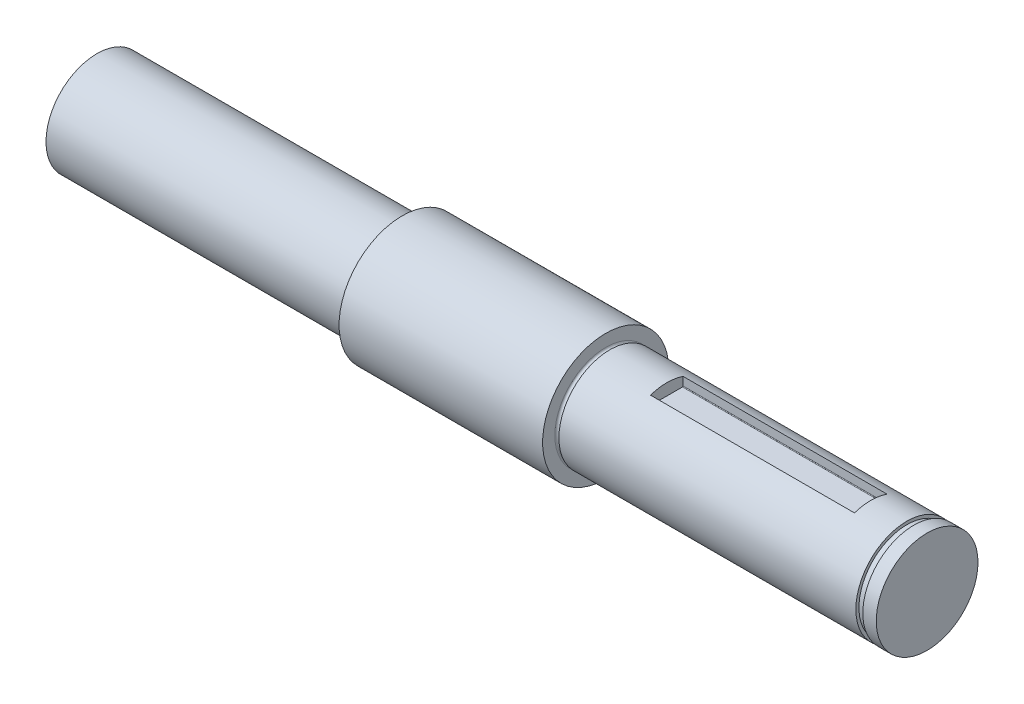
ISO-10303-21;
HEADER;
FILE_DESCRIPTION(('STEP AP214'),'2;1');
FILE_NAME('part.step','',(''),(''),'','','');
FILE_SCHEMA(('AUTOMOTIVE_DESIGN { 1 0 10303 214 1 1 1 1 }'));
ENDSEC;
DATA;
#1=APPLICATION_CONTEXT('core data for automotive mechanical design processes');
#2=APPLICATION_PROTOCOL_DEFINITION('international standard','automotive_design',2000,#1);
#3=PRODUCT_CONTEXT('',#1,'mechanical');
#4=PRODUCT('Part','Part','',(#3));
#5=PRODUCT_RELATED_PRODUCT_CATEGORY('part','',(#4));
#6=PRODUCT_DEFINITION_FORMATION('','',#4);
#7=PRODUCT_DEFINITION_CONTEXT('part definition',#1,'design');
#8=PRODUCT_DEFINITION('design','',#6,#7);
#9=PRODUCT_DEFINITION_SHAPE('','',#8);
#10=(LENGTH_UNIT() NAMED_UNIT(*) SI_UNIT(.MILLI.,.METRE.));
#11=(NAMED_UNIT(*) PLANE_ANGLE_UNIT() SI_UNIT($,.RADIAN.));
#12=(NAMED_UNIT(*) SI_UNIT($,.STERADIAN.) SOLID_ANGLE_UNIT());
#13=UNCERTAINTY_MEASURE_WITH_UNIT(LENGTH_MEASURE(1.E-05),#10,'distance_accuracy_value','');
#14=(GEOMETRIC_REPRESENTATION_CONTEXT(3) GLOBAL_UNCERTAINTY_ASSIGNED_CONTEXT((#13)) GLOBAL_UNIT_ASSIGNED_CONTEXT((#10,
#11,#12)) REPRESENTATION_CONTEXT('',''));
#15=CARTESIAN_POINT('',(0.,0.,0.));
#16=DIRECTION('',(0.,0.,1.));
#17=DIRECTION('',(1.,0.,0.));
#18=AXIS2_PLACEMENT_3D('',#15,#16,#17);
#19=CARTESIAN_POINT('',(200.,0.,0.));
#20=DIRECTION('',(-1.,0.,0.));
#21=DIRECTION('',(0.,0.,1.));
#22=AXIS2_PLACEMENT_3D('',#19,#20,#21);
#23=CYLINDRICAL_SURFACE('',#22,25.);
#24=CARTESIAN_POINT('',(52.,0.,0.));
#25=DIRECTION('',(-1.,0.,0.));
#26=DIRECTION('',(0.,0.,1.));
#27=AXIS2_PLACEMENT_3D('',#24,#25,#26);
#28=CIRCLE('',#27,25.);
#29=CARTESIAN_POINT('',(52.,0.,25.));
#30=VERTEX_POINT('',#29);
#31=EDGE_CURVE('E146',#30,#30,#28,.T.);
#32=ORIENTED_EDGE('',*,*,#31,.F.);
#33=EDGE_LOOP('',(#32));
#34=FACE_BOUND('',#33,.T.);
#35=DIRECTION('',(-1.,0.,0.));
#36=VECTOR('',#35,1.);
#37=CARTESIAN_POINT('',(180.215,23.685438564654,-8.));
#38=LINE('',#37,#36);
#39=CARTESIAN_POINT('',(180.215,23.685438564654,-8.));
#40=VERTEX_POINT('',#39);
#41=CARTESIAN_POINT('',(80.,23.685438564654,-8.));
#42=VERTEX_POINT('',#41);
#43=EDGE_CURVE('E54',#40,#42,#38,.T.);
#44=ORIENTED_EDGE('',*,*,#43,.F.);
#45=CARTESIAN_POINT('',(180.215,0.,0.));
#46=DIRECTION('',(1.,0.,0.));
#47=DIRECTION('',(0.,0.,-1.));
#48=AXIS2_PLACEMENT_3D('',#45,#46,#47);
#49=CIRCLE('',#48,25.);
#50=CARTESIAN_POINT('',(180.215,23.685438564654,8.));
#51=VERTEX_POINT('',#50);
#52=EDGE_CURVE('E135',#40,#51,#49,.T.);
#53=ORIENTED_EDGE('',*,*,#52,.T.);
#54=DIRECTION('',(-1.,0.,0.));
#55=VECTOR('',#54,1.);
#56=CARTESIAN_POINT('',(180.215,23.685438564654,8.));
#57=LINE('',#56,#55);
#58=CARTESIAN_POINT('',(80.,23.685438564654,8.));
#59=VERTEX_POINT('',#58);
#60=EDGE_CURVE('E142',#51,#59,#57,.T.);
#61=ORIENTED_EDGE('',*,*,#60,.T.);
#62=CARTESIAN_POINT('',(80.,0.,0.));
#63=DIRECTION('',(1.,0.,0.));
#64=DIRECTION('',(0.,0.,-1.));
#65=AXIS2_PLACEMENT_3D('',#62,#63,#64);
#66=CIRCLE('',#65,25.);
#67=EDGE_CURVE('E122',#42,#59,#66,.T.);
#68=ORIENTED_EDGE('',*,*,#67,.F.);
#69=EDGE_LOOP('',(#44,#53,#61,#68));
#70=FACE_BOUND('',#69,.T.);
#71=CARTESIAN_POINT('',(197.91,0.,0.));
#72=DIRECTION('',(1.,0.,0.));
#73=DIRECTION('',(0.,0.,-1.));
#74=AXIS2_PLACEMENT_3D('',#71,#72,#73);
#75=CIRCLE('',#74,25.);
#76=CARTESIAN_POINT('',(197.91,0.,-25.));
#77=VERTEX_POINT('',#76);
#78=EDGE_CURVE('E209',#77,#77,#75,.T.);
#79=ORIENTED_EDGE('',*,*,#78,.F.);
#80=EDGE_LOOP('',(#79));
#81=FACE_BOUND('',#80,.T.);
#82=ADVANCED_FACE('F39',(#34,#70,#81),#23,.T.);
#83=CARTESIAN_POINT('',(-200.,0.,0.));
#84=DIRECTION('',(1.,0.,0.));
#85=DIRECTION('',(0.,0.,-1.));
#86=AXIS2_PLACEMENT_3D('',#83,#84,#85);
#87=CIRCLE('',#86,25.);
#88=CARTESIAN_POINT('',(-200.,0.,-25.));
#89=VERTEX_POINT('',#88);
#90=EDGE_CURVE('E153',#89,#89,#87,.T.);
#91=ORIENTED_EDGE('',*,*,#90,.T.);
#92=EDGE_LOOP('',(#91));
#93=FACE_BOUND('',#92,.T.);
#94=CARTESIAN_POINT('',(-52.,0.,0.));
#95=DIRECTION('',(-1.,0.,0.));
#96=DIRECTION('',(0.,0.,1.));
#97=AXIS2_PLACEMENT_3D('',#94,#95,#96);
#98=CIRCLE('',#97,25.);
#99=CARTESIAN_POINT('',(-52.,0.,25.));
#100=VERTEX_POINT('',#99);
#101=EDGE_CURVE('E145',#100,#100,#98,.T.);
#102=ORIENTED_EDGE('',*,*,#101,.T.);
#103=EDGE_LOOP('',(#102));
#104=FACE_BOUND('',#103,.T.);
#105=ADVANCED_FACE('F181',(#93,#104),#23,.T.);
#106=CARTESIAN_POINT('',(-200.,0.,0.));
#107=DIRECTION('',(1.,0.,0.));
#108=DIRECTION('',(0.,0.,-1.));
#109=AXIS2_PLACEMENT_3D('',#106,#107,#108);
#110=PLANE('',#109);
#111=ORIENTED_EDGE('',*,*,#90,.F.);
#112=EDGE_LOOP('',(#111));
#113=FACE_BOUND('',#112,.T.);
#114=ADVANCED_FACE('F175',(#113),#110,.F.);
#115=CARTESIAN_POINT('',(-51.,0.,0.));
#116=DIRECTION('',(-1.,0.,0.));
#117=DIRECTION('',(0.,0.,1.));
#118=AXIS2_PLACEMENT_3D('',#115,#116,#117);
#119=TOROIDAL_SURFACE('',#118,25.,1.);
#120=CARTESIAN_POINT('',(-50.,0.,0.));
#121=DIRECTION('',(-1.,0.,0.));
#122=DIRECTION('',(0.,0.,1.));
#123=AXIS2_PLACEMENT_3D('',#120,#121,#122);
#124=CIRCLE('',#123,25.);
#125=CARTESIAN_POINT('',(-50.,0.,25.));
#126=VERTEX_POINT('',#125);
#127=EDGE_CURVE('E150',#126,#126,#124,.T.);
#128=ORIENTED_EDGE('',*,*,#127,.T.);
#129=EDGE_LOOP('',(#128));
#130=FACE_BOUND('',#129,.T.);
#131=ORIENTED_EDGE('',*,*,#101,.F.);
#132=EDGE_LOOP('',(#131));
#133=FACE_BOUND('',#132,.T.);
#134=ADVANCED_FACE('F167',(#130,#133),#119,.F.);
#135=CARTESIAN_POINT('',(-50.,0.,0.));
#136=DIRECTION('',(1.,0.,0.));
#137=DIRECTION('',(0.,0.,-1.));
#138=AXIS2_PLACEMENT_3D('',#135,#136,#137);
#139=PLANE('',#138);
#140=ORIENTED_EDGE('',*,*,#127,.F.);
#141=EDGE_LOOP('',(#140));
#142=FACE_BOUND('',#141,.T.);
#143=CARTESIAN_POINT('',(-50.,0.,0.));
#144=DIRECTION('',(1.,0.,0.));
#145=DIRECTION('',(0.,0.,-1.));
#146=AXIS2_PLACEMENT_3D('',#143,#144,#145);
#147=CIRCLE('',#146,31.);
#148=CARTESIAN_POINT('',(-50.,0.,-31.));
#149=VERTEX_POINT('',#148);
#150=EDGE_CURVE('E43',#149,#149,#147,.T.);
#151=ORIENTED_EDGE('',*,*,#150,.F.);
#152=EDGE_LOOP('',(#151));
#153=FACE_BOUND('',#152,.T.);
#154=ADVANCED_FACE('F165',(#142,#153),#139,.F.);
#155=CARTESIAN_POINT('',(50.,0.,0.));
#156=DIRECTION('',(-1.,0.,0.));
#157=DIRECTION('',(0.,0.,1.));
#158=AXIS2_PLACEMENT_3D('',#155,#156,#157);
#159=CYLINDRICAL_SURFACE('',#158,31.);
#160=CARTESIAN_POINT('',(50.,0.,0.));
#161=DIRECTION('',(1.,0.,0.));
#162=DIRECTION('',(0.,0.,-1.));
#163=AXIS2_PLACEMENT_3D('',#160,#161,#162);
#164=CIRCLE('',#163,31.);
#165=CARTESIAN_POINT('',(50.,0.,-31.));
#166=VERTEX_POINT('',#165);
#167=EDGE_CURVE('E11',#166,#166,#164,.T.);
#168=ORIENTED_EDGE('',*,*,#167,.F.);
#169=EDGE_LOOP('',(#168));
#170=FACE_BOUND('',#169,.T.);
#171=ORIENTED_EDGE('',*,*,#150,.T.);
#172=EDGE_LOOP('',(#171));
#173=FACE_BOUND('',#172,.T.);
#174=ADVANCED_FACE('F41',(#170,#173),#159,.T.);
#175=CARTESIAN_POINT('',(50.,0.,0.));
#176=DIRECTION('',(1.,0.,0.));
#177=DIRECTION('',(0.,0.,-1.));
#178=AXIS2_PLACEMENT_3D('',#175,#176,#177);
#179=PLANE('',#178);
#180=CARTESIAN_POINT('',(50.,0.,0.));
#181=DIRECTION('',(-1.,0.,0.));
#182=DIRECTION('',(0.,0.,1.));
#183=AXIS2_PLACEMENT_3D('',#180,#181,#182);
#184=CIRCLE('',#183,25.);
#185=CARTESIAN_POINT('',(50.,0.,25.));
#186=VERTEX_POINT('',#185);
#187=EDGE_CURVE('E149',#186,#186,#184,.T.);
#188=ORIENTED_EDGE('',*,*,#187,.T.);
#189=EDGE_LOOP('',(#188));
#190=FACE_BOUND('',#189,.T.);
#191=ORIENTED_EDGE('',*,*,#167,.T.);
#192=EDGE_LOOP('',(#191));
#193=FACE_BOUND('',#192,.T.);
#194=ADVANCED_FACE('F173',(#190,#193),#179,.T.);
#195=CARTESIAN_POINT('',(51.,0.,0.));
#196=DIRECTION('',(-1.,0.,0.));
#197=DIRECTION('',(0.,0.,1.));
#198=AXIS2_PLACEMENT_3D('',#195,#196,#197);
#199=TOROIDAL_SURFACE('',#198,25.,1.);
#200=ORIENTED_EDGE('',*,*,#31,.T.);
#201=EDGE_LOOP('',(#200));
#202=FACE_BOUND('',#201,.T.);
#203=ORIENTED_EDGE('',*,*,#187,.F.);
#204=EDGE_LOOP('',(#203));
#205=FACE_BOUND('',#204,.T.);
#206=ADVANCED_FACE('F241',(#202,#205),#199,.F.);
#207=CARTESIAN_POINT('',(180.215,23.685438564654,8.));
#208=DIRECTION('',(0.,0.,-1.));
#209=DIRECTION('',(-1.,0.,0.));
#210=AXIS2_PLACEMENT_3D('',#207,#208,#209);
#211=PLANE('',#210);
#212=DIRECTION('',(0.,-1.,0.));
#213=VECTOR('',#212,1.);
#214=CARTESIAN_POINT('',(80.,23.685438564654,8.));
#215=LINE('',#214,#213);
#216=CARTESIAN_POINT('',(80.,19.6,8.));
#217=VERTEX_POINT('',#216);
#218=EDGE_CURVE('E125',#59,#217,#215,.T.);
#219=ORIENTED_EDGE('',*,*,#218,.F.);
#220=ORIENTED_EDGE('',*,*,#60,.F.);
#221=DIRECTION('',(0.,-1.,0.));
#222=VECTOR('',#221,1.);
#223=CARTESIAN_POINT('',(180.215,23.685438564654,8.));
#224=LINE('',#223,#222);
#225=CARTESIAN_POINT('',(180.215,19.6,8.));
#226=VERTEX_POINT('',#225);
#227=EDGE_CURVE('E91',#51,#226,#224,.T.);
#228=ORIENTED_EDGE('',*,*,#227,.T.);
#229=DIRECTION('',(-1.,0.,0.));
#230=VECTOR('',#229,1.);
#231=CARTESIAN_POINT('',(180.215,19.6,8.));
#232=LINE('',#231,#230);
#233=EDGE_CURVE('E139',#226,#217,#232,.T.);
#234=ORIENTED_EDGE('',*,*,#233,.T.);
#235=EDGE_LOOP('',(#219,#220,#228,#234));
#236=FACE_BOUND('',#235,.T.);
#237=ADVANCED_FACE('F220',(#236),#211,.T.);
#238=CARTESIAN_POINT('',(180.215,19.6,7.7));
#239=DIRECTION('',(-1.,0.,0.));
#240=DIRECTION('',(0.,0.,1.));
#241=AXIS2_PLACEMENT_3D('',#238,#239,#240);
#242=CYLINDRICAL_SURFACE('',#241,0.299999999999999);
#243=CARTESIAN_POINT('',(80.,19.6,7.7));
#244=DIRECTION('',(1.,0.,0.));
#245=DIRECTION('',(0.,0.,-1.));
#246=AXIS2_PLACEMENT_3D('',#243,#244,#245);
#247=CIRCLE('',#246,0.299999999999999);
#248=CARTESIAN_POINT('',(80.,19.3,7.7));
#249=VERTEX_POINT('',#248);
#250=EDGE_CURVE('E128',#217,#249,#247,.T.);
#251=ORIENTED_EDGE('',*,*,#250,.F.);
#252=ORIENTED_EDGE('',*,*,#233,.F.);
#253=CARTESIAN_POINT('',(180.215,19.6,7.7));
#254=DIRECTION('',(1.,0.,0.));
#255=DIRECTION('',(0.,0.,-1.));
#256=AXIS2_PLACEMENT_3D('',#253,#254,#255);
#257=CIRCLE('',#256,0.299999999999999);
#258=CARTESIAN_POINT('',(180.215,19.3,7.7));
#259=VERTEX_POINT('',#258);
#260=EDGE_CURVE('E111',#226,#259,#257,.T.);
#261=ORIENTED_EDGE('',*,*,#260,.T.);
#262=DIRECTION('',(-1.,0.,0.));
#263=VECTOR('',#262,1.);
#264=CARTESIAN_POINT('',(180.215,19.3,7.7));
#265=LINE('',#264,#263);
#266=EDGE_CURVE('E108',#259,#249,#265,.T.);
#267=ORIENTED_EDGE('',*,*,#266,.T.);
#268=EDGE_LOOP('',(#251,#252,#261,#267));
#269=FACE_BOUND('',#268,.T.);
#270=ADVANCED_FACE('F218',(#269),#242,.F.);
#271=CARTESIAN_POINT('',(180.215,19.3,7.7));
#272=DIRECTION('',(0.,1.,0.));
#273=DIRECTION('',(0.,0.,1.));
#274=AXIS2_PLACEMENT_3D('',#271,#272,#273);
#275=PLANE('',#274);
#276=DIRECTION('',(0.,0.,-1.));
#277=VECTOR('',#276,1.);
#278=CARTESIAN_POINT('',(80.,19.3,7.7));
#279=LINE('',#278,#277);
#280=CARTESIAN_POINT('',(80.,19.3,-7.7));
#281=VERTEX_POINT('',#280);
#282=EDGE_CURVE('E130',#249,#281,#279,.T.);
#283=ORIENTED_EDGE('',*,*,#282,.F.);
#284=ORIENTED_EDGE('',*,*,#266,.F.);
#285=DIRECTION('',(0.,0.,-1.));
#286=VECTOR('',#285,1.);
#287=CARTESIAN_POINT('',(180.215,19.3,7.7));
#288=LINE('',#287,#286);
#289=CARTESIAN_POINT('',(180.215,19.3,-7.7));
#290=VERTEX_POINT('',#289);
#291=EDGE_CURVE('E102',#259,#290,#288,.T.);
#292=ORIENTED_EDGE('',*,*,#291,.T.);
#293=DIRECTION('',(-1.,0.,0.));
#294=VECTOR('',#293,1.);
#295=CARTESIAN_POINT('',(180.215,19.3,-7.7));
#296=LINE('',#295,#294);
#297=EDGE_CURVE('E106',#290,#281,#296,.T.);
#298=ORIENTED_EDGE('',*,*,#297,.T.);
#299=EDGE_LOOP('',(#283,#284,#292,#298));
#300=FACE_BOUND('',#299,.T.);
#301=ADVANCED_FACE('F105',(#300),#275,.T.);
#302=CARTESIAN_POINT('',(180.215,19.6,-7.7));
#303=DIRECTION('',(-1.,0.,0.));
#304=DIRECTION('',(0.,0.,1.));
#305=AXIS2_PLACEMENT_3D('',#302,#303,#304);
#306=CYLINDRICAL_SURFACE('',#305,0.299999999999999);
#307=CARTESIAN_POINT('',(80.,19.6,-7.7));
#308=DIRECTION('',(1.,0.,0.));
#309=DIRECTION('',(0.,0.,-1.));
#310=AXIS2_PLACEMENT_3D('',#307,#308,#309);
#311=CIRCLE('',#310,0.299999999999999);
#312=CARTESIAN_POINT('',(80.,19.6,-8.));
#313=VERTEX_POINT('',#312);
#314=EDGE_CURVE('E83',#281,#313,#311,.T.);
#315=ORIENTED_EDGE('',*,*,#314,.F.);
#316=ORIENTED_EDGE('',*,*,#297,.F.);
#317=CARTESIAN_POINT('',(180.215,19.6,-7.7));
#318=DIRECTION('',(1.,0.,0.));
#319=DIRECTION('',(0.,0.,-1.));
#320=AXIS2_PLACEMENT_3D('',#317,#318,#319);
#321=CIRCLE('',#320,0.299999999999999);
#322=CARTESIAN_POINT('',(180.215,19.6,-8.));
#323=VERTEX_POINT('',#322);
#324=EDGE_CURVE('E110',#290,#323,#321,.T.);
#325=ORIENTED_EDGE('',*,*,#324,.T.);
#326=DIRECTION('',(-1.,0.,0.));
#327=VECTOR('',#326,1.);
#328=CARTESIAN_POINT('',(180.215,19.6,-8.));
#329=LINE('',#328,#327);
#330=EDGE_CURVE('E115',#323,#313,#329,.T.);
#331=ORIENTED_EDGE('',*,*,#330,.T.);
#332=EDGE_LOOP('',(#315,#316,#325,#331));
#333=FACE_BOUND('',#332,.T.);
#334=ADVANCED_FACE('F114',(#333),#306,.F.);
#335=CARTESIAN_POINT('',(180.215,19.6,-8.));
#336=DIRECTION('',(0.,0.,1.));
#337=DIRECTION('',(1.,0.,0.));
#338=AXIS2_PLACEMENT_3D('',#335,#336,#337);
#339=PLANE('',#338);
#340=DIRECTION('',(0.,1.,0.));
#341=VECTOR('',#340,1.);
#342=CARTESIAN_POINT('',(80.,19.6,-8.));
#343=LINE('',#342,#341);
#344=EDGE_CURVE('E133',#313,#42,#343,.T.);
#345=ORIENTED_EDGE('',*,*,#344,.F.);
#346=ORIENTED_EDGE('',*,*,#330,.F.);
#347=DIRECTION('',(0.,1.,0.));
#348=VECTOR('',#347,1.);
#349=CARTESIAN_POINT('',(180.215,19.6,-8.));
#350=LINE('',#349,#348);
#351=EDGE_CURVE('E60',#323,#40,#350,.T.);
#352=ORIENTED_EDGE('',*,*,#351,.T.);
#353=ORIENTED_EDGE('',*,*,#43,.T.);
#354=EDGE_LOOP('',(#345,#346,#352,#353));
#355=FACE_BOUND('',#354,.T.);
#356=ADVANCED_FACE('F224',(#355),#339,.T.);
#357=CARTESIAN_POINT('',(180.215,0.,0.));
#358=DIRECTION('',(1.,0.,0.));
#359=DIRECTION('',(0.,0.,-1.));
#360=AXIS2_PLACEMENT_3D('',#357,#358,#359);
#361=PLANE('',#360);
#362=ORIENTED_EDGE('',*,*,#52,.F.);
#363=ORIENTED_EDGE('',*,*,#351,.F.);
#364=ORIENTED_EDGE('',*,*,#324,.F.);
#365=ORIENTED_EDGE('',*,*,#291,.F.);
#366=ORIENTED_EDGE('',*,*,#260,.F.);
#367=ORIENTED_EDGE('',*,*,#227,.F.);
#368=EDGE_LOOP('',(#362,#363,#364,#365,#366,#367));
#369=FACE_BOUND('',#368,.T.);
#370=ADVANCED_FACE('F117',(#369),#361,.F.);
#371=CARTESIAN_POINT('',(80.,0.,0.));
#372=DIRECTION('',(1.,0.,0.));
#373=DIRECTION('',(0.,0.,-1.));
#374=AXIS2_PLACEMENT_3D('',#371,#372,#373);
#375=PLANE('',#374);
#376=ORIENTED_EDGE('',*,*,#67,.T.);
#377=ORIENTED_EDGE('',*,*,#218,.T.);
#378=ORIENTED_EDGE('',*,*,#250,.T.);
#379=ORIENTED_EDGE('',*,*,#282,.T.);
#380=ORIENTED_EDGE('',*,*,#314,.T.);
#381=ORIENTED_EDGE('',*,*,#344,.T.);
#382=EDGE_LOOP('',(#376,#377,#378,#379,#380,#381));
#383=FACE_BOUND('',#382,.T.);
#384=ADVANCED_FACE('F223',(#383),#375,.T.);
#385=CARTESIAN_POINT('',(201.31,0.,0.));
#386=DIRECTION('',(1.,0.,0.));
#387=DIRECTION('',(0.,0.,-1.));
#388=AXIS2_PLACEMENT_3D('',#385,#386,#387);
#389=PLANE('',#388);
#390=CARTESIAN_POINT('',(201.31,0.,0.));
#391=DIRECTION('',(1.,0.,0.));
#392=DIRECTION('',(0.,0.,-1.));
#393=AXIS2_PLACEMENT_3D('',#390,#391,#392);
#394=CIRCLE('',#393,25.);
#395=CARTESIAN_POINT('',(201.31,0.,-25.));
#396=VERTEX_POINT('',#395);
#397=EDGE_CURVE('E205',#396,#396,#394,.T.);
#398=ORIENTED_EDGE('',*,*,#397,.F.);
#399=EDGE_LOOP('',(#398));
#400=FACE_BOUND('',#399,.T.);
#401=CARTESIAN_POINT('',(201.31,0.,0.));
#402=DIRECTION('',(1.,0.,0.));
#403=DIRECTION('',(0.,0.,-1.));
#404=AXIS2_PLACEMENT_3D('',#401,#402,#403);
#405=CIRCLE('',#404,23.5);
#406=CARTESIAN_POINT('',(201.31,0.,-23.5));
#407=VERTEX_POINT('',#406);
#408=EDGE_CURVE('E419',#407,#407,#405,.T.);
#409=ORIENTED_EDGE('',*,*,#408,.T.);
#410=EDGE_LOOP('',(#409));
#411=FACE_BOUND('',#410,.T.);
#412=ADVANCED_FACE('F314',(#400,#411),#389,.F.);
#413=CARTESIAN_POINT('',(197.91,0.,0.));
#414=DIRECTION('',(1.,0.,0.));
#415=DIRECTION('',(0.,0.,-1.));
#416=AXIS2_PLACEMENT_3D('',#413,#414,#415);
#417=PLANE('',#416);
#418=ORIENTED_EDGE('',*,*,#78,.T.);
#419=EDGE_LOOP('',(#418));
#420=FACE_BOUND('',#419,.T.);
#421=CARTESIAN_POINT('',(197.91,0.,0.));
#422=DIRECTION('',(1.,0.,0.));
#423=DIRECTION('',(0.,0.,-1.));
#424=AXIS2_PLACEMENT_3D('',#421,#422,#423);
#425=CIRCLE('',#424,23.5);
#426=CARTESIAN_POINT('',(197.91,0.,-23.5));
#427=VERTEX_POINT('',#426);
#428=EDGE_CURVE('E422',#427,#427,#425,.T.);
#429=ORIENTED_EDGE('',*,*,#428,.F.);
#430=EDGE_LOOP('',(#429));
#431=FACE_BOUND('',#430,.T.);
#432=ADVANCED_FACE('F337',(#420,#431),#417,.T.);
#433=CARTESIAN_POINT('',(201.31,0.,0.));
#434=DIRECTION('',(-1.,0.,0.));
#435=DIRECTION('',(0.,0.,1.));
#436=AXIS2_PLACEMENT_3D('',#433,#434,#435);
#437=CYLINDRICAL_SURFACE('',#436,23.5);
#438=ORIENTED_EDGE('',*,*,#408,.F.);
#439=EDGE_LOOP('',(#438));
#440=FACE_BOUND('',#439,.T.);
#441=ORIENTED_EDGE('',*,*,#428,.T.);
#442=EDGE_LOOP('',(#441));
#443=FACE_BOUND('',#442,.T.);
#444=ADVANCED_FACE('F199',(#440,#443),#437,.T.);
#445=CARTESIAN_POINT('',(207.91,0.,0.));
#446=DIRECTION('',(1.,0.,0.));
#447=DIRECTION('',(0.,0.,-1.));
#448=AXIS2_PLACEMENT_3D('',#445,#446,#447);
#449=PLANE('',#448);
#450=CARTESIAN_POINT('',(207.91,0.,0.));
#451=DIRECTION('',(1.,0.,0.));
#452=DIRECTION('',(0.,0.,-1.));
#453=AXIS2_PLACEMENT_3D('',#450,#451,#452);
#454=CIRCLE('',#453,25.);
#455=CARTESIAN_POINT('',(207.91,0.,-25.));
#456=VERTEX_POINT('',#455);
#457=EDGE_CURVE('E126',#456,#456,#454,.T.);
#458=ORIENTED_EDGE('',*,*,#457,.T.);
#459=EDGE_LOOP('',(#458));
#460=FACE_BOUND('',#459,.T.);
#461=ADVANCED_FACE('F194',(#460),#449,.T.);
#462=ORIENTED_EDGE('',*,*,#397,.T.);
#463=EDGE_LOOP('',(#462));
#464=FACE_BOUND('',#463,.T.);
#465=ORIENTED_EDGE('',*,*,#457,.F.);
#466=EDGE_LOOP('',(#465));
#467=FACE_BOUND('',#466,.T.);
#468=ADVANCED_FACE('F184',(#464,#467),#23,.T.);
#469=CLOSED_SHELL('',(#82,#105,#114,#134,#154,#174,#194,#206,#237,#270,#301,#334,#356,#370,#384,
#412,#432,#444,#461,#468));
#470=MANIFOLD_SOLID_BREP('B2',#469);
#471=ADVANCED_BREP_SHAPE_REPRESENTATION('',(#18,#470),#14);
#472=SHAPE_DEFINITION_REPRESENTATION(#9,#471);
ENDSEC;
END-ISO-10303-21;
